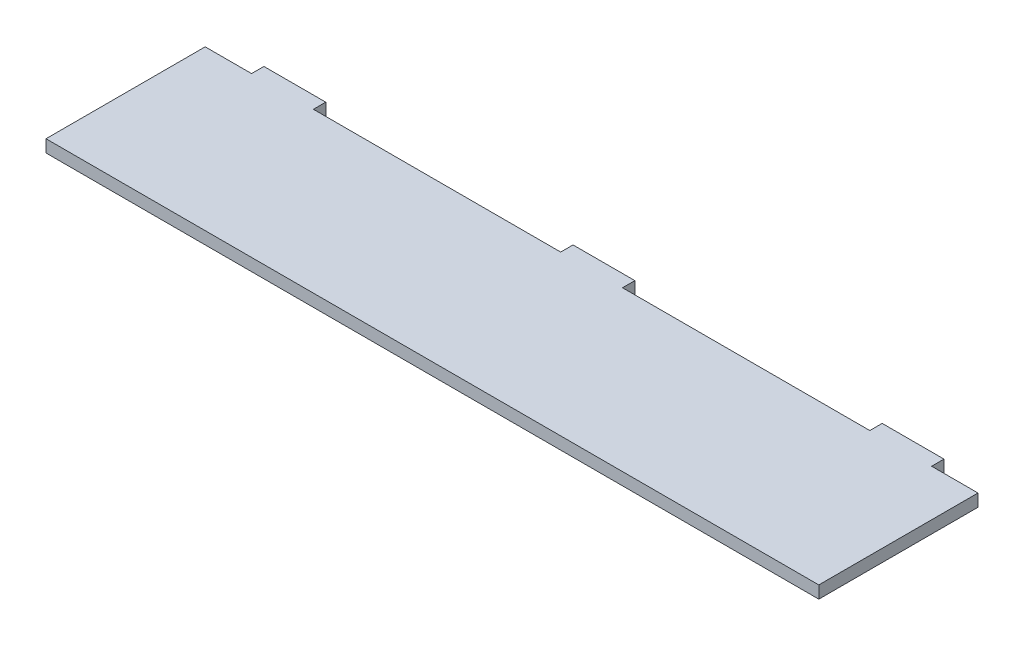
ISO-10303-21;
HEADER;
FILE_DESCRIPTION(('STEP AP214'),'2;1');
FILE_NAME('part.step','',(''),(''),'','','');
FILE_SCHEMA(('AUTOMOTIVE_DESIGN { 1 0 10303 214 1 1 1 1 }'));
ENDSEC;
DATA;
#1=APPLICATION_CONTEXT('core data for automotive mechanical design processes');
#2=APPLICATION_PROTOCOL_DEFINITION('international standard','automotive_design',2000,#1);
#3=PRODUCT_CONTEXT('',#1,'mechanical');
#4=PRODUCT('Part','Part','',(#3));
#5=PRODUCT_RELATED_PRODUCT_CATEGORY('part','',(#4));
#6=PRODUCT_DEFINITION_FORMATION('','',#4);
#7=PRODUCT_DEFINITION_CONTEXT('part definition',#1,'design');
#8=PRODUCT_DEFINITION('design','',#6,#7);
#9=PRODUCT_DEFINITION_SHAPE('','',#8);
#10=(LENGTH_UNIT() NAMED_UNIT(*) SI_UNIT(.MILLI.,.METRE.));
#11=(NAMED_UNIT(*) PLANE_ANGLE_UNIT() SI_UNIT($,.RADIAN.));
#12=(NAMED_UNIT(*) SI_UNIT($,.STERADIAN.) SOLID_ANGLE_UNIT());
#13=UNCERTAINTY_MEASURE_WITH_UNIT(LENGTH_MEASURE(1.E-05),#10,'distance_accuracy_value','');
#14=(GEOMETRIC_REPRESENTATION_CONTEXT(3) GLOBAL_UNCERTAINTY_ASSIGNED_CONTEXT((#13)) GLOBAL_UNIT_ASSIGNED_CONTEXT((#10,
#11,#12)) REPRESENTATION_CONTEXT('',''));
#15=CARTESIAN_POINT('',(0.,0.,0.));
#16=DIRECTION('',(0.,0.,1.));
#17=DIRECTION('',(1.,0.,0.));
#18=AXIS2_PLACEMENT_3D('',#15,#16,#17);
#19=CARTESIAN_POINT('',(-125.,4.,27.75));
#20=DIRECTION('',(0.,0.,-1.));
#21=DIRECTION('',(-1.,0.,0.));
#22=AXIS2_PLACEMENT_3D('',#19,#20,#21);
#23=PLANE('',#22);
#24=DIRECTION('',(1.,0.,0.));
#25=VECTOR('',#24,1.);
#26=CARTESIAN_POINT('',(-125.,0.,27.75));
#27=LINE('',#26,#25);
#28=CARTESIAN_POINT('',(-125.,0.,27.75));
#29=VERTEX_POINT('',#28);
#30=CARTESIAN_POINT('',(125.,0.,27.75));
#31=VERTEX_POINT('',#30);
#32=EDGE_CURVE('E181',#29,#31,#27,.T.);
#33=ORIENTED_EDGE('',*,*,#32,.T.);
#34=DIRECTION('',(0.,-1.,0.));
#35=VECTOR('',#34,1.);
#36=CARTESIAN_POINT('',(125.,4.,27.75));
#37=LINE('',#36,#35);
#38=CARTESIAN_POINT('',(125.,4.,27.75));
#39=VERTEX_POINT('',#38);
#40=EDGE_CURVE('E11',#39,#31,#37,.T.);
#41=ORIENTED_EDGE('',*,*,#40,.F.);
#42=DIRECTION('',(1.,0.,0.));
#43=VECTOR('',#42,1.);
#44=CARTESIAN_POINT('',(-125.,4.,27.75));
#45=LINE('',#44,#43);
#46=CARTESIAN_POINT('',(-125.,4.,27.75));
#47=VERTEX_POINT('',#46);
#48=EDGE_CURVE('E211',#47,#39,#45,.T.);
#49=ORIENTED_EDGE('',*,*,#48,.F.);
#50=DIRECTION('',(0.,-1.,0.));
#51=VECTOR('',#50,1.);
#52=CARTESIAN_POINT('',(-125.,4.,27.75));
#53=LINE('',#52,#51);
#54=EDGE_CURVE('E177',#47,#29,#53,.T.);
#55=ORIENTED_EDGE('',*,*,#54,.T.);
#56=EDGE_LOOP('',(#33,#41,#49,#55));
#57=FACE_BOUND('',#56,.T.);
#58=ADVANCED_FACE('F37',(#57),#23,.F.);
#59=CARTESIAN_POINT('',(125.,4.,-23.75));
#60=DIRECTION('',(-1.,0.,0.));
#61=DIRECTION('',(0.,0.,1.));
#62=AXIS2_PLACEMENT_3D('',#59,#60,#61);
#63=PLANE('',#62);
#64=DIRECTION('',(0.,0.,-1.));
#65=VECTOR('',#64,1.);
#66=CARTESIAN_POINT('',(125.,0.,-23.75));
#67=LINE('',#66,#65);
#68=CARTESIAN_POINT('',(125.,0.,-23.75));
#69=VERTEX_POINT('',#68);
#70=EDGE_CURVE('E184',#31,#69,#67,.T.);
#71=ORIENTED_EDGE('',*,*,#70,.T.);
#72=DIRECTION('',(0.,-1.,0.));
#73=VECTOR('',#72,1.);
#74=CARTESIAN_POINT('',(125.,4.,-23.75));
#75=LINE('',#74,#73);
#76=CARTESIAN_POINT('',(125.,4.,-23.75));
#77=VERTEX_POINT('',#76);
#78=EDGE_CURVE('E45',#77,#69,#75,.T.);
#79=ORIENTED_EDGE('',*,*,#78,.F.);
#80=DIRECTION('',(0.,0.,-1.));
#81=VECTOR('',#80,1.);
#82=CARTESIAN_POINT('',(125.,4.,-23.75));
#83=LINE('',#82,#81);
#84=EDGE_CURVE('E120',#39,#77,#83,.T.);
#85=ORIENTED_EDGE('',*,*,#84,.F.);
#86=ORIENTED_EDGE('',*,*,#40,.T.);
#87=EDGE_LOOP('',(#71,#79,#85,#86));
#88=FACE_BOUND('',#87,.T.);
#89=ADVANCED_FACE('F309',(#88),#63,.F.);
#90=CARTESIAN_POINT('',(110.,4.,-23.75));
#91=DIRECTION('',(0.,0.,1.));
#92=DIRECTION('',(1.,0.,0.));
#93=AXIS2_PLACEMENT_3D('',#90,#91,#92);
#94=PLANE('',#93);
#95=DIRECTION('',(-1.,0.,0.));
#96=VECTOR('',#95,1.);
#97=CARTESIAN_POINT('',(110.,0.,-23.75));
#98=LINE('',#97,#96);
#99=CARTESIAN_POINT('',(110.,0.,-23.75));
#100=VERTEX_POINT('',#99);
#101=EDGE_CURVE('E186',#69,#100,#98,.T.);
#102=ORIENTED_EDGE('',*,*,#101,.T.);
#103=DIRECTION('',(0.,-1.,0.));
#104=VECTOR('',#103,1.);
#105=CARTESIAN_POINT('',(110.,4.,-23.75));
#106=LINE('',#105,#104);
#107=CARTESIAN_POINT('',(110.,4.,-23.75));
#108=VERTEX_POINT('',#107);
#109=EDGE_CURVE('E242',#108,#100,#106,.T.);
#110=ORIENTED_EDGE('',*,*,#109,.F.);
#111=DIRECTION('',(-1.,0.,0.));
#112=VECTOR('',#111,1.);
#113=CARTESIAN_POINT('',(110.,4.,-23.75));
#114=LINE('',#113,#112);
#115=EDGE_CURVE('E250',#77,#108,#114,.T.);
#116=ORIENTED_EDGE('',*,*,#115,.F.);
#117=ORIENTED_EDGE('',*,*,#78,.T.);
#118=EDGE_LOOP('',(#102,#110,#116,#117));
#119=FACE_BOUND('',#118,.T.);
#120=ADVANCED_FACE('F248',(#119),#94,.F.);
#121=CARTESIAN_POINT('',(110.,4.,-27.75));
#122=DIRECTION('',(-1.,0.,0.));
#123=DIRECTION('',(0.,0.,1.));
#124=AXIS2_PLACEMENT_3D('',#121,#122,#123);
#125=PLANE('',#124);
#126=DIRECTION('',(0.,0.,-1.));
#127=VECTOR('',#126,1.);
#128=CARTESIAN_POINT('',(110.,0.,-27.75));
#129=LINE('',#128,#127);
#130=CARTESIAN_POINT('',(110.,0.,-27.75));
#131=VERTEX_POINT('',#130);
#132=EDGE_CURVE('E188',#100,#131,#129,.T.);
#133=ORIENTED_EDGE('',*,*,#132,.T.);
#134=DIRECTION('',(0.,-1.,0.));
#135=VECTOR('',#134,1.);
#136=CARTESIAN_POINT('',(110.,4.,-27.75));
#137=LINE('',#136,#135);
#138=CARTESIAN_POINT('',(110.,4.,-27.75));
#139=VERTEX_POINT('',#138);
#140=EDGE_CURVE('E239',#139,#131,#137,.T.);
#141=ORIENTED_EDGE('',*,*,#140,.F.);
#142=DIRECTION('',(0.,0.,-1.));
#143=VECTOR('',#142,1.);
#144=CARTESIAN_POINT('',(110.,4.,-27.75));
#145=LINE('',#144,#143);
#146=EDGE_CURVE('E268',#108,#139,#145,.T.);
#147=ORIENTED_EDGE('',*,*,#146,.F.);
#148=ORIENTED_EDGE('',*,*,#109,.T.);
#149=EDGE_LOOP('',(#133,#141,#147,#148));
#150=FACE_BOUND('',#149,.T.);
#151=ADVANCED_FACE('F259',(#150),#125,.F.);
#152=CARTESIAN_POINT('',(110.,4.,-27.75));
#153=DIRECTION('',(0.,0.,1.));
#154=DIRECTION('',(1.,0.,0.));
#155=AXIS2_PLACEMENT_3D('',#152,#153,#154);
#156=PLANE('',#155);
#157=DIRECTION('',(-1.,0.,0.));
#158=VECTOR('',#157,1.);
#159=CARTESIAN_POINT('',(110.,0.,-27.75));
#160=LINE('',#159,#158);
#161=CARTESIAN_POINT('',(90.,0.,-27.75));
#162=VERTEX_POINT('',#161);
#163=EDGE_CURVE('E190',#131,#162,#160,.T.);
#164=ORIENTED_EDGE('',*,*,#163,.T.);
#165=DIRECTION('',(0.,-1.,0.));
#166=VECTOR('',#165,1.);
#167=CARTESIAN_POINT('',(90.,4.,-27.75));
#168=LINE('',#167,#166);
#169=CARTESIAN_POINT('',(90.,4.,-27.75));
#170=VERTEX_POINT('',#169);
#171=EDGE_CURVE('E236',#170,#162,#168,.T.);
#172=ORIENTED_EDGE('',*,*,#171,.F.);
#173=DIRECTION('',(-1.,0.,0.));
#174=VECTOR('',#173,1.);
#175=CARTESIAN_POINT('',(110.,4.,-27.75));
#176=LINE('',#175,#174);
#177=EDGE_CURVE('E265',#139,#170,#176,.T.);
#178=ORIENTED_EDGE('',*,*,#177,.F.);
#179=ORIENTED_EDGE('',*,*,#140,.T.);
#180=EDGE_LOOP('',(#164,#172,#178,#179));
#181=FACE_BOUND('',#180,.T.);
#182=ADVANCED_FACE('F263',(#181),#156,.F.);
#183=CARTESIAN_POINT('',(90.,4.,-27.75));
#184=DIRECTION('',(1.,0.,0.));
#185=DIRECTION('',(0.,0.,-1.));
#186=AXIS2_PLACEMENT_3D('',#183,#184,#185);
#187=PLANE('',#186);
#188=DIRECTION('',(0.,0.,1.));
#189=VECTOR('',#188,1.);
#190=CARTESIAN_POINT('',(90.,0.,-27.75));
#191=LINE('',#190,#189);
#192=CARTESIAN_POINT('',(90.,0.,-23.75));
#193=VERTEX_POINT('',#192);
#194=EDGE_CURVE('E192',#162,#193,#191,.T.);
#195=ORIENTED_EDGE('',*,*,#194,.T.);
#196=DIRECTION('',(0.,-1.,0.));
#197=VECTOR('',#196,1.);
#198=CARTESIAN_POINT('',(90.,4.,-23.75));
#199=LINE('',#198,#197);
#200=CARTESIAN_POINT('',(90.,4.,-23.75));
#201=VERTEX_POINT('',#200);
#202=EDGE_CURVE('E233',#201,#193,#199,.T.);
#203=ORIENTED_EDGE('',*,*,#202,.F.);
#204=DIRECTION('',(0.,0.,1.));
#205=VECTOR('',#204,1.);
#206=CARTESIAN_POINT('',(90.,4.,-27.75));
#207=LINE('',#206,#205);
#208=EDGE_CURVE('E267',#170,#201,#207,.T.);
#209=ORIENTED_EDGE('',*,*,#208,.F.);
#210=ORIENTED_EDGE('',*,*,#171,.T.);
#211=EDGE_LOOP('',(#195,#203,#209,#210));
#212=FACE_BOUND('',#211,.T.);
#213=ADVANCED_FACE('F322',(#212),#187,.F.);
#214=CARTESIAN_POINT('',(90.,4.,-23.75));
#215=DIRECTION('',(0.,0.,1.));
#216=DIRECTION('',(1.,0.,0.));
#217=AXIS2_PLACEMENT_3D('',#214,#215,#216);
#218=PLANE('',#217);
#219=DIRECTION('',(-1.,0.,0.));
#220=VECTOR('',#219,1.);
#221=CARTESIAN_POINT('',(90.,0.,-23.75));
#222=LINE('',#221,#220);
#223=CARTESIAN_POINT('',(10.,0.,-23.75));
#224=VERTEX_POINT('',#223);
#225=EDGE_CURVE('E194',#193,#224,#222,.T.);
#226=ORIENTED_EDGE('',*,*,#225,.T.);
#227=DIRECTION('',(0.,-1.,0.));
#228=VECTOR('',#227,1.);
#229=CARTESIAN_POINT('',(10.,4.,-23.75));
#230=LINE('',#229,#228);
#231=CARTESIAN_POINT('',(10.,4.,-23.75));
#232=VERTEX_POINT('',#231);
#233=EDGE_CURVE('E230',#232,#224,#230,.T.);
#234=ORIENTED_EDGE('',*,*,#233,.F.);
#235=DIRECTION('',(-1.,0.,0.));
#236=VECTOR('',#235,1.);
#237=CARTESIAN_POINT('',(90.,4.,-23.75));
#238=LINE('',#237,#236);
#239=EDGE_CURVE('E270',#201,#232,#238,.T.);
#240=ORIENTED_EDGE('',*,*,#239,.F.);
#241=ORIENTED_EDGE('',*,*,#202,.T.);
#242=EDGE_LOOP('',(#226,#234,#240,#241));
#243=FACE_BOUND('',#242,.T.);
#244=ADVANCED_FACE('F325',(#243),#218,.F.);
#245=CARTESIAN_POINT('',(10.,4.,-23.75));
#246=DIRECTION('',(-1.,0.,0.));
#247=DIRECTION('',(0.,0.,1.));
#248=AXIS2_PLACEMENT_3D('',#245,#246,#247);
#249=PLANE('',#248);
#250=DIRECTION('',(0.,0.,-1.));
#251=VECTOR('',#250,1.);
#252=CARTESIAN_POINT('',(10.,0.,-23.75));
#253=LINE('',#252,#251);
#254=CARTESIAN_POINT('',(10.,0.,-27.75));
#255=VERTEX_POINT('',#254);
#256=EDGE_CURVE('E196',#224,#255,#253,.T.);
#257=ORIENTED_EDGE('',*,*,#256,.T.);
#258=DIRECTION('',(0.,-1.,0.));
#259=VECTOR('',#258,1.);
#260=CARTESIAN_POINT('',(10.,4.,-27.75));
#261=LINE('',#260,#259);
#262=CARTESIAN_POINT('',(10.,4.,-27.75));
#263=VERTEX_POINT('',#262);
#264=EDGE_CURVE('E227',#263,#255,#261,.T.);
#265=ORIENTED_EDGE('',*,*,#264,.F.);
#266=DIRECTION('',(0.,0.,-1.));
#267=VECTOR('',#266,1.);
#268=CARTESIAN_POINT('',(10.,4.,-23.75));
#269=LINE('',#268,#267);
#270=EDGE_CURVE('E276',#232,#263,#269,.T.);
#271=ORIENTED_EDGE('',*,*,#270,.F.);
#272=ORIENTED_EDGE('',*,*,#233,.T.);
#273=EDGE_LOOP('',(#257,#265,#271,#272));
#274=FACE_BOUND('',#273,.T.);
#275=ADVANCED_FACE('F329',(#274),#249,.F.);
#276=CARTESIAN_POINT('',(-10.,4.,-27.75));
#277=DIRECTION('',(0.,0.,1.));
#278=DIRECTION('',(1.,0.,0.));
#279=AXIS2_PLACEMENT_3D('',#276,#277,#278);
#280=PLANE('',#279);
#281=DIRECTION('',(-1.,0.,0.));
#282=VECTOR('',#281,1.);
#283=CARTESIAN_POINT('',(-10.,0.,-27.75));
#284=LINE('',#283,#282);
#285=CARTESIAN_POINT('',(-10.,0.,-27.75));
#286=VERTEX_POINT('',#285);
#287=EDGE_CURVE('E198',#255,#286,#284,.T.);
#288=ORIENTED_EDGE('',*,*,#287,.T.);
#289=DIRECTION('',(0.,-1.,0.));
#290=VECTOR('',#289,1.);
#291=CARTESIAN_POINT('',(-10.,4.,-27.75));
#292=LINE('',#291,#290);
#293=CARTESIAN_POINT('',(-10.,4.,-27.75));
#294=VERTEX_POINT('',#293);
#295=EDGE_CURVE('E224',#294,#286,#292,.T.);
#296=ORIENTED_EDGE('',*,*,#295,.F.);
#297=DIRECTION('',(-1.,0.,0.));
#298=VECTOR('',#297,1.);
#299=CARTESIAN_POINT('',(-10.,4.,-27.75));
#300=LINE('',#299,#298);
#301=EDGE_CURVE('E278',#263,#294,#300,.T.);
#302=ORIENTED_EDGE('',*,*,#301,.F.);
#303=ORIENTED_EDGE('',*,*,#264,.T.);
#304=EDGE_LOOP('',(#288,#296,#302,#303));
#305=FACE_BOUND('',#304,.T.);
#306=ADVANCED_FACE('F333',(#305),#280,.F.);
#307=CARTESIAN_POINT('',(-10.,4.,-23.75));
#308=DIRECTION('',(1.,0.,0.));
#309=DIRECTION('',(0.,0.,-1.));
#310=AXIS2_PLACEMENT_3D('',#307,#308,#309);
#311=PLANE('',#310);
#312=DIRECTION('',(0.,0.,1.));
#313=VECTOR('',#312,1.);
#314=CARTESIAN_POINT('',(-10.,0.,-23.75));
#315=LINE('',#314,#313);
#316=CARTESIAN_POINT('',(-10.,0.,-23.75));
#317=VERTEX_POINT('',#316);
#318=EDGE_CURVE('E200',#286,#317,#315,.T.);
#319=ORIENTED_EDGE('',*,*,#318,.T.);
#320=DIRECTION('',(0.,-1.,0.));
#321=VECTOR('',#320,1.);
#322=CARTESIAN_POINT('',(-10.,4.,-23.75));
#323=LINE('',#322,#321);
#324=CARTESIAN_POINT('',(-10.,4.,-23.75));
#325=VERTEX_POINT('',#324);
#326=EDGE_CURVE('E221',#325,#317,#323,.T.);
#327=ORIENTED_EDGE('',*,*,#326,.F.);
#328=DIRECTION('',(0.,0.,1.));
#329=VECTOR('',#328,1.);
#330=CARTESIAN_POINT('',(-10.,4.,-23.75));
#331=LINE('',#330,#329);
#332=EDGE_CURVE('E280',#294,#325,#331,.T.);
#333=ORIENTED_EDGE('',*,*,#332,.F.);
#334=ORIENTED_EDGE('',*,*,#295,.T.);
#335=EDGE_LOOP('',(#319,#327,#333,#334));
#336=FACE_BOUND('',#335,.T.);
#337=ADVANCED_FACE('F337',(#336),#311,.F.);
#338=CARTESIAN_POINT('',(-90.,4.,-23.75));
#339=DIRECTION('',(0.,0.,1.));
#340=DIRECTION('',(1.,0.,0.));
#341=AXIS2_PLACEMENT_3D('',#338,#339,#340);
#342=PLANE('',#341);
#343=DIRECTION('',(-1.,0.,0.));
#344=VECTOR('',#343,1.);
#345=CARTESIAN_POINT('',(-90.,0.,-23.75));
#346=LINE('',#345,#344);
#347=CARTESIAN_POINT('',(-90.,0.,-23.75));
#348=VERTEX_POINT('',#347);
#349=EDGE_CURVE('E202',#317,#348,#346,.T.);
#350=ORIENTED_EDGE('',*,*,#349,.T.);
#351=DIRECTION('',(0.,-1.,0.));
#352=VECTOR('',#351,1.);
#353=CARTESIAN_POINT('',(-90.,4.,-23.75));
#354=LINE('',#353,#352);
#355=CARTESIAN_POINT('',(-90.,4.,-23.75));
#356=VERTEX_POINT('',#355);
#357=EDGE_CURVE('E218',#356,#348,#354,.T.);
#358=ORIENTED_EDGE('',*,*,#357,.F.);
#359=DIRECTION('',(-1.,0.,0.));
#360=VECTOR('',#359,1.);
#361=CARTESIAN_POINT('',(-90.,4.,-23.75));
#362=LINE('',#361,#360);
#363=EDGE_CURVE('E282',#325,#356,#362,.T.);
#364=ORIENTED_EDGE('',*,*,#363,.F.);
#365=ORIENTED_EDGE('',*,*,#326,.T.);
#366=EDGE_LOOP('',(#350,#358,#364,#365));
#367=FACE_BOUND('',#366,.T.);
#368=ADVANCED_FACE('F341',(#367),#342,.F.);
#369=CARTESIAN_POINT('',(-90.,4.,-27.75));
#370=DIRECTION('',(-1.,0.,0.));
#371=DIRECTION('',(0.,0.,1.));
#372=AXIS2_PLACEMENT_3D('',#369,#370,#371);
#373=PLANE('',#372);
#374=DIRECTION('',(0.,0.,-1.));
#375=VECTOR('',#374,1.);
#376=CARTESIAN_POINT('',(-90.,0.,-27.75));
#377=LINE('',#376,#375);
#378=CARTESIAN_POINT('',(-90.,0.,-27.75));
#379=VERTEX_POINT('',#378);
#380=EDGE_CURVE('E204',#348,#379,#377,.T.);
#381=ORIENTED_EDGE('',*,*,#380,.T.);
#382=DIRECTION('',(0.,-1.,0.));
#383=VECTOR('',#382,1.);
#384=CARTESIAN_POINT('',(-90.,4.,-27.75));
#385=LINE('',#384,#383);
#386=CARTESIAN_POINT('',(-90.,4.,-27.75));
#387=VERTEX_POINT('',#386);
#388=EDGE_CURVE('E215',#387,#379,#385,.T.);
#389=ORIENTED_EDGE('',*,*,#388,.F.);
#390=DIRECTION('',(0.,0.,-1.));
#391=VECTOR('',#390,1.);
#392=CARTESIAN_POINT('',(-90.,4.,-27.75));
#393=LINE('',#392,#391);
#394=EDGE_CURVE('E284',#356,#387,#393,.T.);
#395=ORIENTED_EDGE('',*,*,#394,.F.);
#396=ORIENTED_EDGE('',*,*,#357,.T.);
#397=EDGE_LOOP('',(#381,#389,#395,#396));
#398=FACE_BOUND('',#397,.T.);
#399=ADVANCED_FACE('F290',(#398),#373,.F.);
#400=CARTESIAN_POINT('',(-110.,4.,-27.75));
#401=DIRECTION('',(0.,0.,1.));
#402=DIRECTION('',(1.,0.,0.));
#403=AXIS2_PLACEMENT_3D('',#400,#401,#402);
#404=PLANE('',#403);
#405=DIRECTION('',(-1.,0.,0.));
#406=VECTOR('',#405,1.);
#407=CARTESIAN_POINT('',(-110.,0.,-27.75));
#408=LINE('',#407,#406);
#409=CARTESIAN_POINT('',(-110.,0.,-27.75));
#410=VERTEX_POINT('',#409);
#411=EDGE_CURVE('E206',#379,#410,#408,.T.);
#412=ORIENTED_EDGE('',*,*,#411,.T.);
#413=DIRECTION('',(0.,-1.,0.));
#414=VECTOR('',#413,1.);
#415=CARTESIAN_POINT('',(-110.,4.,-27.75));
#416=LINE('',#415,#414);
#417=CARTESIAN_POINT('',(-110.,4.,-27.75));
#418=VERTEX_POINT('',#417);
#419=EDGE_CURVE('E172',#418,#410,#416,.T.);
#420=ORIENTED_EDGE('',*,*,#419,.F.);
#421=DIRECTION('',(-1.,0.,0.));
#422=VECTOR('',#421,1.);
#423=CARTESIAN_POINT('',(-110.,4.,-27.75));
#424=LINE('',#423,#422);
#425=EDGE_CURVE('E163',#387,#418,#424,.T.);
#426=ORIENTED_EDGE('',*,*,#425,.F.);
#427=ORIENTED_EDGE('',*,*,#388,.T.);
#428=EDGE_LOOP('',(#412,#420,#426,#427));
#429=FACE_BOUND('',#428,.T.);
#430=ADVANCED_FACE('F294',(#429),#404,.F.);
#431=CARTESIAN_POINT('',(-110.,4.,-27.75));
#432=DIRECTION('',(1.,0.,0.));
#433=DIRECTION('',(0.,0.,-1.));
#434=AXIS2_PLACEMENT_3D('',#431,#432,#433);
#435=PLANE('',#434);
#436=DIRECTION('',(0.,0.,1.));
#437=VECTOR('',#436,1.);
#438=CARTESIAN_POINT('',(-110.,0.,-27.75));
#439=LINE('',#438,#437);
#440=CARTESIAN_POINT('',(-110.,0.,-23.75));
#441=VERTEX_POINT('',#440);
#442=EDGE_CURVE('E171',#410,#441,#439,.T.);
#443=ORIENTED_EDGE('',*,*,#442,.T.);
#444=DIRECTION('',(0.,-1.,0.));
#445=VECTOR('',#444,1.);
#446=CARTESIAN_POINT('',(-110.,4.,-23.75));
#447=LINE('',#446,#445);
#448=CARTESIAN_POINT('',(-110.,4.,-23.75));
#449=VERTEX_POINT('',#448);
#450=EDGE_CURVE('E168',#449,#441,#447,.T.);
#451=ORIENTED_EDGE('',*,*,#450,.F.);
#452=DIRECTION('',(0.,0.,1.));
#453=VECTOR('',#452,1.);
#454=CARTESIAN_POINT('',(-110.,4.,-27.75));
#455=LINE('',#454,#453);
#456=EDGE_CURVE('E157',#418,#449,#455,.T.);
#457=ORIENTED_EDGE('',*,*,#456,.F.);
#458=ORIENTED_EDGE('',*,*,#419,.T.);
#459=EDGE_LOOP('',(#443,#451,#457,#458));
#460=FACE_BOUND('',#459,.T.);
#461=ADVANCED_FACE('F169',(#460),#435,.F.);
#462=CARTESIAN_POINT('',(-110.,4.,-23.75));
#463=DIRECTION('',(0.,0.,1.));
#464=DIRECTION('',(1.,0.,0.));
#465=AXIS2_PLACEMENT_3D('',#462,#463,#464);
#466=PLANE('',#465);
#467=DIRECTION('',(-1.,0.,0.));
#468=VECTOR('',#467,1.);
#469=CARTESIAN_POINT('',(-110.,0.,-23.75));
#470=LINE('',#469,#468);
#471=CARTESIAN_POINT('',(-125.,0.,-23.75));
#472=VERTEX_POINT('',#471);
#473=EDGE_CURVE('E106',#441,#472,#470,.T.);
#474=ORIENTED_EDGE('',*,*,#473,.T.);
#475=DIRECTION('',(0.,-1.,0.));
#476=VECTOR('',#475,1.);
#477=CARTESIAN_POINT('',(-125.,4.,-23.75));
#478=LINE('',#477,#476);
#479=CARTESIAN_POINT('',(-125.,4.,-23.75));
#480=VERTEX_POINT('',#479);
#481=EDGE_CURVE('E173',#480,#472,#478,.T.);
#482=ORIENTED_EDGE('',*,*,#481,.F.);
#483=DIRECTION('',(-1.,0.,0.));
#484=VECTOR('',#483,1.);
#485=CARTESIAN_POINT('',(-110.,4.,-23.75));
#486=LINE('',#485,#484);
#487=EDGE_CURVE('E161',#449,#480,#486,.T.);
#488=ORIENTED_EDGE('',*,*,#487,.F.);
#489=ORIENTED_EDGE('',*,*,#450,.T.);
#490=EDGE_LOOP('',(#474,#482,#488,#489));
#491=FACE_BOUND('',#490,.T.);
#492=ADVANCED_FACE('F175',(#491),#466,.F.);
#493=CARTESIAN_POINT('',(-125.,4.,-23.75));
#494=DIRECTION('',(1.,0.,0.));
#495=DIRECTION('',(0.,0.,-1.));
#496=AXIS2_PLACEMENT_3D('',#493,#494,#495);
#497=PLANE('',#496);
#498=DIRECTION('',(0.,0.,1.));
#499=VECTOR('',#498,1.);
#500=CARTESIAN_POINT('',(-125.,0.,-23.75));
#501=LINE('',#500,#499);
#502=EDGE_CURVE('E112',#472,#29,#501,.T.);
#503=ORIENTED_EDGE('',*,*,#502,.T.);
#504=ORIENTED_EDGE('',*,*,#54,.F.);
#505=DIRECTION('',(0.,0.,1.));
#506=VECTOR('',#505,1.);
#507=CARTESIAN_POINT('',(-125.,4.,-23.75));
#508=LINE('',#507,#506);
#509=EDGE_CURVE('E53',#480,#47,#508,.T.);
#510=ORIENTED_EDGE('',*,*,#509,.F.);
#511=ORIENTED_EDGE('',*,*,#481,.T.);
#512=EDGE_LOOP('',(#503,#504,#510,#511));
#513=FACE_BOUND('',#512,.T.);
#514=ADVANCED_FACE('F298',(#513),#497,.F.);
#515=CARTESIAN_POINT('',(0.,4.,0.));
#516=DIRECTION('',(0.,-1.,0.));
#517=DIRECTION('',(0.,0.,-1.));
#518=AXIS2_PLACEMENT_3D('',#515,#516,#517);
#519=PLANE('',#518);
#520=ORIENTED_EDGE('',*,*,#48,.T.);
#521=ORIENTED_EDGE('',*,*,#84,.T.);
#522=ORIENTED_EDGE('',*,*,#115,.T.);
#523=ORIENTED_EDGE('',*,*,#146,.T.);
#524=ORIENTED_EDGE('',*,*,#177,.T.);
#525=ORIENTED_EDGE('',*,*,#208,.T.);
#526=ORIENTED_EDGE('',*,*,#239,.T.);
#527=ORIENTED_EDGE('',*,*,#270,.T.);
#528=ORIENTED_EDGE('',*,*,#301,.T.);
#529=ORIENTED_EDGE('',*,*,#332,.T.);
#530=ORIENTED_EDGE('',*,*,#363,.T.);
#531=ORIENTED_EDGE('',*,*,#394,.T.);
#532=ORIENTED_EDGE('',*,*,#425,.T.);
#533=ORIENTED_EDGE('',*,*,#456,.T.);
#534=ORIENTED_EDGE('',*,*,#487,.T.);
#535=ORIENTED_EDGE('',*,*,#509,.T.);
#536=EDGE_LOOP('',(#520,#521,#522,#523,#524,#525,#526,#527,#528,#529,#530,#531,#532,#533,#534,#535));
#537=FACE_BOUND('',#536,.T.);
#538=ADVANCED_FACE('F159',(#537),#519,.F.);
#539=CARTESIAN_POINT('',(0.,0.,0.));
#540=DIRECTION('',(0.,-1.,0.));
#541=DIRECTION('',(0.,0.,-1.));
#542=AXIS2_PLACEMENT_3D('',#539,#540,#541);
#543=PLANE('',#542);
#544=ORIENTED_EDGE('',*,*,#32,.F.);
#545=ORIENTED_EDGE('',*,*,#502,.F.);
#546=ORIENTED_EDGE('',*,*,#473,.F.);
#547=ORIENTED_EDGE('',*,*,#442,.F.);
#548=ORIENTED_EDGE('',*,*,#411,.F.);
#549=ORIENTED_EDGE('',*,*,#380,.F.);
#550=ORIENTED_EDGE('',*,*,#349,.F.);
#551=ORIENTED_EDGE('',*,*,#318,.F.);
#552=ORIENTED_EDGE('',*,*,#287,.F.);
#553=ORIENTED_EDGE('',*,*,#256,.F.);
#554=ORIENTED_EDGE('',*,*,#225,.F.);
#555=ORIENTED_EDGE('',*,*,#194,.F.);
#556=ORIENTED_EDGE('',*,*,#163,.F.);
#557=ORIENTED_EDGE('',*,*,#132,.F.);
#558=ORIENTED_EDGE('',*,*,#101,.F.);
#559=ORIENTED_EDGE('',*,*,#70,.F.);
#560=EDGE_LOOP('',(#544,#545,#546,#547,#548,#549,#550,#551,#552,#553,#554,#555,#556,#557,#558,#559));
#561=FACE_BOUND('',#560,.T.);
#562=ADVANCED_FACE('F254',(#561),#543,.T.);
#563=CLOSED_SHELL('',(#58,#89,#120,#151,#182,#213,#244,#275,#306,#337,#368,#399,#430,#461,#492,
#514,#538,#562));
#564=MANIFOLD_SOLID_BREP('B2',#563);
#565=ADVANCED_BREP_SHAPE_REPRESENTATION('',(#18,#564),#14);
#566=SHAPE_DEFINITION_REPRESENTATION(#9,#565);
ENDSEC;
END-ISO-10303-21;
